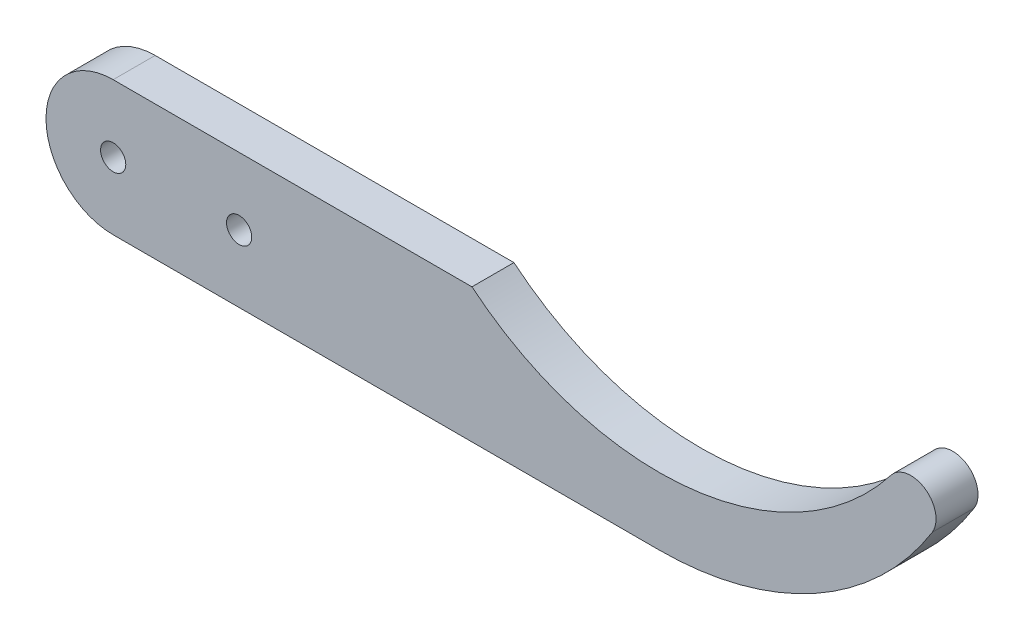
ISO-10303-21;
HEADER;
FILE_DESCRIPTION(('STEP AP214'),'2;1');
FILE_NAME('part.step','',(''),(''),'','','');
FILE_SCHEMA(('AUTOMOTIVE_DESIGN { 1 0 10303 214 1 1 1 1 }'));
ENDSEC;
DATA;
#1=APPLICATION_CONTEXT('core data for automotive mechanical design processes');
#2=APPLICATION_PROTOCOL_DEFINITION('international standard','automotive_design',2000,#1);
#3=PRODUCT_CONTEXT('',#1,'mechanical');
#4=PRODUCT('Part','Part','',(#3));
#5=PRODUCT_RELATED_PRODUCT_CATEGORY('part','',(#4));
#6=PRODUCT_DEFINITION_FORMATION('','',#4);
#7=PRODUCT_DEFINITION_CONTEXT('part definition',#1,'design');
#8=PRODUCT_DEFINITION('design','',#6,#7);
#9=PRODUCT_DEFINITION_SHAPE('','',#8);
#10=(LENGTH_UNIT() NAMED_UNIT(*) SI_UNIT(.MILLI.,.METRE.));
#11=(NAMED_UNIT(*) PLANE_ANGLE_UNIT() SI_UNIT($,.RADIAN.));
#12=(NAMED_UNIT(*) SI_UNIT($,.STERADIAN.) SOLID_ANGLE_UNIT());
#13=UNCERTAINTY_MEASURE_WITH_UNIT(LENGTH_MEASURE(1.E-05),#10,'distance_accuracy_value','');
#14=(GEOMETRIC_REPRESENTATION_CONTEXT(3) GLOBAL_UNCERTAINTY_ASSIGNED_CONTEXT((#13)) GLOBAL_UNIT_ASSIGNED_CONTEXT((#10,
#11,#12)) REPRESENTATION_CONTEXT('',''));
#15=CARTESIAN_POINT('',(0.,0.,0.));
#16=DIRECTION('',(0.,0.,1.));
#17=DIRECTION('',(1.,0.,0.));
#18=AXIS2_PLACEMENT_3D('',#15,#16,#17);
#19=CARTESIAN_POINT('',(-15.,0.,5.));
#20=DIRECTION('',(0.,0.,1.));
#21=DIRECTION('',(1.,0.,0.));
#22=AXIS2_PLACEMENT_3D('',#19,#20,#21);
#23=PLANE('',#22);
#24=CARTESIAN_POINT('',(0.,0.,5.));
#25=DIRECTION('',(0.,0.,1.));
#26=DIRECTION('',(1.,0.,0.));
#27=AXIS2_PLACEMENT_3D('',#24,#25,#26);
#28=CIRCLE('',#27,1.5);
#29=CARTESIAN_POINT('',(1.5,0.,5.));
#30=VERTEX_POINT('',#29);
#31=EDGE_CURVE('E127',#30,#30,#28,.T.);
#32=ORIENTED_EDGE('',*,*,#31,.F.);
#33=EDGE_LOOP('',(#32));
#34=FACE_BOUND('',#33,.T.);
#35=DIRECTION('',(-1.,0.,0.));
#36=VECTOR('',#35,1.);
#37=CARTESIAN_POINT('',(0.,8.,5.));
#38=LINE('',#37,#36);
#39=CARTESIAN_POINT('',(27.7289425486799,8.,5.));
#40=VERTEX_POINT('',#39);
#41=CARTESIAN_POINT('',(-15.,8.,5.));
#42=VERTEX_POINT('',#41);
#43=EDGE_CURVE('E50',#40,#42,#38,.T.);
#44=ORIENTED_EDGE('',*,*,#43,.T.);
#45=CARTESIAN_POINT('',(-15.,0.,5.));
#46=DIRECTION('',(0.,0.,1.));
#47=DIRECTION('',(1.,0.,0.));
#48=AXIS2_PLACEMENT_3D('',#45,#46,#47);
#49=CIRCLE('',#48,8.);
#50=CARTESIAN_POINT('',(-15.,-8.,5.));
#51=VERTEX_POINT('',#50);
#52=EDGE_CURVE('E89',#42,#51,#49,.T.);
#53=ORIENTED_EDGE('',*,*,#52,.T.);
#54=DIRECTION('',(1.,0.,0.));
#55=VECTOR('',#54,1.);
#56=CARTESIAN_POINT('',(0.,-8.,5.));
#57=LINE('',#56,#55);
#58=CARTESIAN_POINT('',(50.,-8.00000000000001,5.));
#59=VERTEX_POINT('',#58);
#60=EDGE_CURVE('E103',#51,#59,#57,.T.);
#61=ORIENTED_EDGE('',*,*,#60,.T.);
#62=CARTESIAN_POINT('',(50.,30.3226733037957,5.));
#63=DIRECTION('',(0.,0.,1.));
#64=DIRECTION('',(1.,0.,0.));
#65=AXIS2_PLACEMENT_3D('',#62,#63,#64);
#66=CIRCLE('',#65,38.3226733037957);
#67=CARTESIAN_POINT('',(82.5479385216953,10.0925228560754,5.));
#68=VERTEX_POINT('',#67);
#69=EDGE_CURVE('E97',#59,#68,#66,.T.);
#70=ORIENTED_EDGE('',*,*,#69,.T.);
#71=CARTESIAN_POINT('',(80.,11.6761924206188,5.));
#72=DIRECTION('',(0.,0.,1.));
#73=DIRECTION('',(-1.,0.,0.));
#74=AXIS2_PLACEMENT_3D('',#71,#72,#73);
#75=CIRCLE('',#74,3.00000000000001);
#76=CARTESIAN_POINT('',(77.6315789473684,13.5175456505699,5.));
#77=VERTEX_POINT('',#76);
#78=EDGE_CURVE('E101',#68,#77,#75,.T.);
#79=ORIENTED_EDGE('',*,*,#78,.T.);
#80=CARTESIAN_POINT('',(50.,35.,5.));
#81=DIRECTION('',(0.,0.,-1.));
#82=DIRECTION('',(1.,0.,0.));
#83=AXIS2_PLACEMENT_3D('',#80,#81,#82);
#84=CIRCLE('',#83,35.);
#85=EDGE_CURVE('E117',#77,#40,#84,.T.);
#86=ORIENTED_EDGE('',*,*,#85,.T.);
#87=EDGE_LOOP('',(#44,#53,#61,#70,#79,#86));
#88=FACE_BOUND('',#87,.T.);
#89=CARTESIAN_POINT('',(-15.,0.,5.));
#90=DIRECTION('',(0.,0.,1.));
#91=DIRECTION('',(1.,0.,0.));
#92=AXIS2_PLACEMENT_3D('',#89,#90,#91);
#93=CIRCLE('',#92,1.5);
#94=CARTESIAN_POINT('',(-13.5,0.,5.));
#95=VERTEX_POINT('',#94);
#96=EDGE_CURVE('E173',#95,#95,#93,.T.);
#97=ORIENTED_EDGE('',*,*,#96,.F.);
#98=EDGE_LOOP('',(#97));
#99=FACE_BOUND('',#98,.T.);
#100=ADVANCED_FACE('F33',(#34,#88,#99),#23,.T.);
#101=CARTESIAN_POINT('',(-15.,0.,0.));
#102=DIRECTION('',(0.,0.,1.));
#103=DIRECTION('',(1.,0.,0.));
#104=AXIS2_PLACEMENT_3D('',#101,#102,#103);
#105=PLANE('',#104);
#106=CARTESIAN_POINT('',(0.,0.,0.));
#107=DIRECTION('',(0.,0.,1.));
#108=DIRECTION('',(1.,0.,0.));
#109=AXIS2_PLACEMENT_3D('',#106,#107,#108);
#110=CIRCLE('',#109,1.5);
#111=CARTESIAN_POINT('',(1.5,0.,0.));
#112=VERTEX_POINT('',#111);
#113=EDGE_CURVE('E178',#112,#112,#110,.T.);
#114=ORIENTED_EDGE('',*,*,#113,.T.);
#115=EDGE_LOOP('',(#114));
#116=FACE_BOUND('',#115,.T.);
#117=CARTESIAN_POINT('',(-15.,0.,0.));
#118=DIRECTION('',(0.,0.,1.));
#119=DIRECTION('',(1.,0.,0.));
#120=AXIS2_PLACEMENT_3D('',#117,#118,#119);
#121=CIRCLE('',#120,8.);
#122=CARTESIAN_POINT('',(-15.,8.,0.));
#123=VERTEX_POINT('',#122);
#124=CARTESIAN_POINT('',(-15.,-8.,0.));
#125=VERTEX_POINT('',#124);
#126=EDGE_CURVE('E123',#123,#125,#121,.T.);
#127=ORIENTED_EDGE('',*,*,#126,.F.);
#128=DIRECTION('',(-1.,0.,0.));
#129=VECTOR('',#128,1.);
#130=CARTESIAN_POINT('',(0.,8.,0.));
#131=LINE('',#130,#129);
#132=CARTESIAN_POINT('',(27.7289425486799,8.,0.));
#133=VERTEX_POINT('',#132);
#134=EDGE_CURVE('E81',#133,#123,#131,.T.);
#135=ORIENTED_EDGE('',*,*,#134,.F.);
#136=CARTESIAN_POINT('',(50.,35.,0.));
#137=DIRECTION('',(0.,0.,-1.));
#138=DIRECTION('',(1.,0.,0.));
#139=AXIS2_PLACEMENT_3D('',#136,#137,#138);
#140=CIRCLE('',#139,35.);
#141=CARTESIAN_POINT('',(77.6315789473684,13.5175456505699,0.));
#142=VERTEX_POINT('',#141);
#143=EDGE_CURVE('E131',#142,#133,#140,.T.);
#144=ORIENTED_EDGE('',*,*,#143,.F.);
#145=CARTESIAN_POINT('',(80.,11.6761924206188,0.));
#146=DIRECTION('',(0.,0.,1.));
#147=DIRECTION('',(-1.,0.,0.));
#148=AXIS2_PLACEMENT_3D('',#145,#146,#147);
#149=CIRCLE('',#148,3.00000000000001);
#150=CARTESIAN_POINT('',(82.5479385216953,10.0925228560754,0.));
#151=VERTEX_POINT('',#150);
#152=EDGE_CURVE('E74',#151,#142,#149,.T.);
#153=ORIENTED_EDGE('',*,*,#152,.F.);
#154=CARTESIAN_POINT('',(50.,30.3226733037957,0.));
#155=DIRECTION('',(0.,0.,1.));
#156=DIRECTION('',(1.,0.,0.));
#157=AXIS2_PLACEMENT_3D('',#154,#155,#156);
#158=CIRCLE('',#157,38.3226733037957);
#159=CARTESIAN_POINT('',(50.,-8.00000000000001,0.));
#160=VERTEX_POINT('',#159);
#161=EDGE_CURVE('E111',#160,#151,#158,.T.);
#162=ORIENTED_EDGE('',*,*,#161,.F.);
#163=DIRECTION('',(1.,0.,0.));
#164=VECTOR('',#163,1.);
#165=CARTESIAN_POINT('',(0.,-8.,0.));
#166=LINE('',#165,#164);
#167=EDGE_CURVE('E126',#125,#160,#166,.T.);
#168=ORIENTED_EDGE('',*,*,#167,.F.);
#169=EDGE_LOOP('',(#127,#135,#144,#153,#162,#168));
#170=FACE_BOUND('',#169,.T.);
#171=CARTESIAN_POINT('',(-15.,0.,0.));
#172=DIRECTION('',(0.,0.,1.));
#173=DIRECTION('',(1.,0.,0.));
#174=AXIS2_PLACEMENT_3D('',#171,#172,#173);
#175=CIRCLE('',#174,1.5);
#176=CARTESIAN_POINT('',(-13.5,0.,0.));
#177=VERTEX_POINT('',#176);
#178=EDGE_CURVE('E176',#177,#177,#175,.T.);
#179=ORIENTED_EDGE('',*,*,#178,.T.);
#180=EDGE_LOOP('',(#179));
#181=FACE_BOUND('',#180,.T.);
#182=ADVANCED_FACE('F139',(#116,#170,#181),#105,.F.);
#183=CARTESIAN_POINT('',(-15.,0.,5.));
#184=DIRECTION('',(0.,0.,-1.));
#185=DIRECTION('',(-1.,0.,0.));
#186=AXIS2_PLACEMENT_3D('',#183,#184,#185);
#187=CYLINDRICAL_SURFACE('',#186,8.);
#188=ORIENTED_EDGE('',*,*,#126,.T.);
#189=DIRECTION('',(0.,0.,-1.));
#190=VECTOR('',#189,1.);
#191=CARTESIAN_POINT('',(-15.,-8.,5.));
#192=LINE('',#191,#190);
#193=EDGE_CURVE('E42',#51,#125,#192,.T.);
#194=ORIENTED_EDGE('',*,*,#193,.F.);
#195=ORIENTED_EDGE('',*,*,#52,.F.);
#196=DIRECTION('',(0.,0.,-1.));
#197=VECTOR('',#196,1.);
#198=CARTESIAN_POINT('',(-15.,8.,5.));
#199=LINE('',#198,#197);
#200=EDGE_CURVE('E11',#42,#123,#199,.T.);
#201=ORIENTED_EDGE('',*,*,#200,.T.);
#202=EDGE_LOOP('',(#188,#194,#195,#201));
#203=FACE_BOUND('',#202,.T.);
#204=ADVANCED_FACE('F35',(#203),#187,.T.);
#205=CARTESIAN_POINT('',(0.,-8.,5.));
#206=DIRECTION('',(0.,1.,0.));
#207=DIRECTION('',(0.,0.,1.));
#208=AXIS2_PLACEMENT_3D('',#205,#206,#207);
#209=PLANE('',#208);
#210=ORIENTED_EDGE('',*,*,#167,.T.);
#211=DIRECTION('',(0.,0.,-1.));
#212=VECTOR('',#211,1.);
#213=CARTESIAN_POINT('',(50.,-8.00000000000001,5.));
#214=LINE('',#213,#212);
#215=EDGE_CURVE('E112',#59,#160,#214,.T.);
#216=ORIENTED_EDGE('',*,*,#215,.F.);
#217=ORIENTED_EDGE('',*,*,#60,.F.);
#218=ORIENTED_EDGE('',*,*,#193,.T.);
#219=EDGE_LOOP('',(#210,#216,#217,#218));
#220=FACE_BOUND('',#219,.T.);
#221=ADVANCED_FACE('F138',(#220),#209,.F.);
#222=CARTESIAN_POINT('',(50.,30.3226733037957,5.));
#223=DIRECTION('',(0.,0.,-1.));
#224=DIRECTION('',(-1.,0.,0.));
#225=AXIS2_PLACEMENT_3D('',#222,#223,#224);
#226=CYLINDRICAL_SURFACE('',#225,38.3226733037957);
#227=ORIENTED_EDGE('',*,*,#161,.T.);
#228=DIRECTION('',(0.,0.,-1.));
#229=VECTOR('',#228,1.);
#230=CARTESIAN_POINT('',(82.5479385216953,10.0925228560754,5.));
#231=LINE('',#230,#229);
#232=EDGE_CURVE('E108',#68,#151,#231,.T.);
#233=ORIENTED_EDGE('',*,*,#232,.F.);
#234=ORIENTED_EDGE('',*,*,#69,.F.);
#235=ORIENTED_EDGE('',*,*,#215,.T.);
#236=EDGE_LOOP('',(#227,#233,#234,#235));
#237=FACE_BOUND('',#236,.T.);
#238=ADVANCED_FACE('F109',(#237),#226,.T.);
#239=CARTESIAN_POINT('',(80.,11.6761924206188,5.));
#240=DIRECTION('',(0.,0.,-1.));
#241=DIRECTION('',(-1.,0.,0.));
#242=AXIS2_PLACEMENT_3D('',#239,#240,#241);
#243=CYLINDRICAL_SURFACE('',#242,3.00000000000001);
#244=ORIENTED_EDGE('',*,*,#152,.T.);
#245=DIRECTION('',(0.,0.,-1.));
#246=VECTOR('',#245,1.);
#247=CARTESIAN_POINT('',(77.6315789473684,13.5175456505699,5.));
#248=LINE('',#247,#246);
#249=EDGE_CURVE('E113',#77,#142,#248,.T.);
#250=ORIENTED_EDGE('',*,*,#249,.F.);
#251=ORIENTED_EDGE('',*,*,#78,.F.);
#252=ORIENTED_EDGE('',*,*,#232,.T.);
#253=EDGE_LOOP('',(#244,#250,#251,#252));
#254=FACE_BOUND('',#253,.T.);
#255=ADVANCED_FACE('F115',(#254),#243,.T.);
#256=CARTESIAN_POINT('',(50.,35.,5.));
#257=DIRECTION('',(0.,0.,-1.));
#258=DIRECTION('',(-1.,0.,0.));
#259=AXIS2_PLACEMENT_3D('',#256,#257,#258);
#260=CYLINDRICAL_SURFACE('',#259,35.);
#261=ORIENTED_EDGE('',*,*,#143,.T.);
#262=DIRECTION('',(0.,0.,-1.));
#263=VECTOR('',#262,1.);
#264=CARTESIAN_POINT('',(27.7289425486799,8.,5.));
#265=LINE('',#264,#263);
#266=EDGE_CURVE('E119',#40,#133,#265,.T.);
#267=ORIENTED_EDGE('',*,*,#266,.F.);
#268=ORIENTED_EDGE('',*,*,#85,.F.);
#269=ORIENTED_EDGE('',*,*,#249,.T.);
#270=EDGE_LOOP('',(#261,#267,#268,#269));
#271=FACE_BOUND('',#270,.T.);
#272=ADVANCED_FACE('F143',(#271),#260,.F.);
#273=CARTESIAN_POINT('',(0.,8.,5.));
#274=DIRECTION('',(0.,-1.,0.));
#275=DIRECTION('',(0.,0.,-1.));
#276=AXIS2_PLACEMENT_3D('',#273,#274,#275);
#277=PLANE('',#276);
#278=ORIENTED_EDGE('',*,*,#134,.T.);
#279=ORIENTED_EDGE('',*,*,#200,.F.);
#280=ORIENTED_EDGE('',*,*,#43,.F.);
#281=ORIENTED_EDGE('',*,*,#266,.T.);
#282=EDGE_LOOP('',(#278,#279,#280,#281));
#283=FACE_BOUND('',#282,.T.);
#284=ADVANCED_FACE('F144',(#283),#277,.F.);
#285=CARTESIAN_POINT('',(0.,0.,5.));
#286=DIRECTION('',(0.,0.,-1.));
#287=DIRECTION('',(-1.,0.,0.));
#288=AXIS2_PLACEMENT_3D('',#285,#286,#287);
#289=CYLINDRICAL_SURFACE('',#288,1.5);
#290=ORIENTED_EDGE('',*,*,#31,.T.);
#291=EDGE_LOOP('',(#290));
#292=FACE_BOUND('',#291,.T.);
#293=ORIENTED_EDGE('',*,*,#113,.F.);
#294=EDGE_LOOP('',(#293));
#295=FACE_BOUND('',#294,.T.);
#296=ADVANCED_FACE('F146',(#292,#295),#289,.F.);
#297=CARTESIAN_POINT('',(-15.,0.,5.));
#298=DIRECTION('',(0.,0.,-1.));
#299=DIRECTION('',(-1.,0.,0.));
#300=AXIS2_PLACEMENT_3D('',#297,#298,#299);
#301=CYLINDRICAL_SURFACE('',#300,1.5);
#302=ORIENTED_EDGE('',*,*,#96,.T.);
#303=EDGE_LOOP('',(#302));
#304=FACE_BOUND('',#303,.T.);
#305=ORIENTED_EDGE('',*,*,#178,.F.);
#306=EDGE_LOOP('',(#305));
#307=FACE_BOUND('',#306,.T.);
#308=ADVANCED_FACE('F152',(#304,#307),#301,.F.);
#309=CLOSED_SHELL('',(#100,#182,#204,#221,#238,#255,#272,#284,#296,#308));
#310=MANIFOLD_SOLID_BREP('B2',#309);
#311=ADVANCED_BREP_SHAPE_REPRESENTATION('',(#18,#310),#14);
#312=SHAPE_DEFINITION_REPRESENTATION(#9,#311);
ENDSEC;
END-ISO-10303-21;
